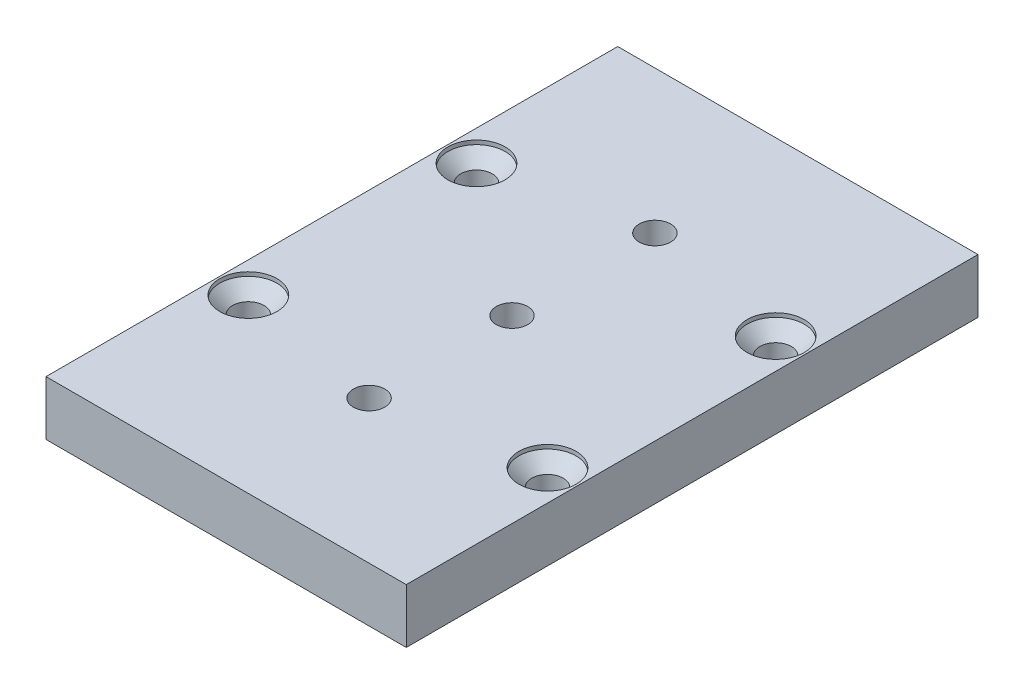
ISO-10303-21;
HEADER;
FILE_DESCRIPTION(('STEP AP214'),'2;1');
FILE_NAME('part.step','',(''),(''),'','','');
FILE_SCHEMA(('AUTOMOTIVE_DESIGN { 1 0 10303 214 1 1 1 1 }'));
ENDSEC;
DATA;
#1=APPLICATION_CONTEXT('core data for automotive mechanical design processes');
#2=APPLICATION_PROTOCOL_DEFINITION('international standard','automotive_design',2000,#1);
#3=PRODUCT_CONTEXT('',#1,'mechanical');
#4=PRODUCT('Part','Part','',(#3));
#5=PRODUCT_RELATED_PRODUCT_CATEGORY('part','',(#4));
#6=PRODUCT_DEFINITION_FORMATION('','',#4);
#7=PRODUCT_DEFINITION_CONTEXT('part definition',#1,'design');
#8=PRODUCT_DEFINITION('design','',#6,#7);
#9=PRODUCT_DEFINITION_SHAPE('','',#8);
#10=(LENGTH_UNIT() NAMED_UNIT(*) SI_UNIT(.MILLI.,.METRE.));
#11=(NAMED_UNIT(*) PLANE_ANGLE_UNIT() SI_UNIT($,.RADIAN.));
#12=(NAMED_UNIT(*) SI_UNIT($,.STERADIAN.) SOLID_ANGLE_UNIT());
#13=UNCERTAINTY_MEASURE_WITH_UNIT(LENGTH_MEASURE(1.E-05),#10,'distance_accuracy_value','');
#14=(GEOMETRIC_REPRESENTATION_CONTEXT(3) GLOBAL_UNCERTAINTY_ASSIGNED_CONTEXT((#13)) GLOBAL_UNIT_ASSIGNED_CONTEXT((#10,
#11,#12)) REPRESENTATION_CONTEXT('',''));
#15=CARTESIAN_POINT('',(0.,0.,0.));
#16=DIRECTION('',(0.,0.,1.));
#17=DIRECTION('',(1.,0.,0.));
#18=AXIS2_PLACEMENT_3D('',#15,#16,#17);
#19=CARTESIAN_POINT('',(-26.1599999999905,10.,-19.9500000000002));
#20=DIRECTION('',(0.,-1.,0.));
#21=DIRECTION('',(0.,0.,-1.));
#22=AXIS2_PLACEMENT_3D('',#19,#20,#21);
#23=CYLINDRICAL_SURFACE('',#22,2.75);
#24=CARTESIAN_POINT('',(-26.1599999999905,6.57500000000001,-19.9500000000002));
#25=DIRECTION('',(0.,1.,0.));
#26=DIRECTION('',(0.,0.,1.));
#27=AXIS2_PLACEMENT_3D('',#24,#25,#26);
#28=CIRCLE('',#27,2.75);
#29=CARTESIAN_POINT('',(-26.1599999999905,6.57500000000001,-17.2000000000002));
#30=VERTEX_POINT('',#29);
#31=EDGE_CURVE('E156',#30,#30,#28,.T.);
#32=ORIENTED_EDGE('',*,*,#31,.T.);
#33=EDGE_LOOP('',(#32));
#34=FACE_BOUND('',#33,.T.);
#35=CARTESIAN_POINT('',(-26.1599999999905,0.,-19.9500000000002));
#36=DIRECTION('',(0.,-1.,0.));
#37=DIRECTION('',(0.,0.,-1.));
#38=AXIS2_PLACEMENT_3D('',#35,#36,#37);
#39=CIRCLE('',#38,2.75);
#40=CARTESIAN_POINT('',(-26.1599999999905,0.,-22.7000000000002));
#41=VERTEX_POINT('',#40);
#42=EDGE_CURVE('E126',#41,#41,#39,.T.);
#43=ORIENTED_EDGE('',*,*,#42,.T.);
#44=EDGE_LOOP('',(#43));
#45=FACE_BOUND('',#44,.T.);
#46=ADVANCED_FACE('F31',(#34,#45),#23,.F.);
#47=CARTESIAN_POINT('',(-26.1599999999905,10.,19.9509032471841));
#48=DIRECTION('',(0.,-1.,0.));
#49=DIRECTION('',(0.,0.,-1.));
#50=AXIS2_PLACEMENT_3D('',#47,#48,#49);
#51=CYLINDRICAL_SURFACE('',#50,2.75);
#52=CARTESIAN_POINT('',(-26.1599999999905,6.575,19.9509032471841));
#53=DIRECTION('',(0.,1.,0.));
#54=DIRECTION('',(0.,0.,1.));
#55=AXIS2_PLACEMENT_3D('',#52,#53,#54);
#56=CIRCLE('',#55,2.75);
#57=CARTESIAN_POINT('',(-26.1599999999905,6.575,22.7009032471841));
#58=VERTEX_POINT('',#57);
#59=EDGE_CURVE('E162',#58,#58,#56,.T.);
#60=ORIENTED_EDGE('',*,*,#59,.T.);
#61=EDGE_LOOP('',(#60));
#62=FACE_BOUND('',#61,.T.);
#63=CARTESIAN_POINT('',(-26.1599999999905,0.,19.9509032471841));
#64=DIRECTION('',(0.,-1.,0.));
#65=DIRECTION('',(0.,0.,-1.));
#66=AXIS2_PLACEMENT_3D('',#63,#64,#65);
#67=CIRCLE('',#66,2.75);
#68=CARTESIAN_POINT('',(-26.1599999999905,0.,17.2009032471841));
#69=VERTEX_POINT('',#68);
#70=EDGE_CURVE('E98',#69,#69,#67,.T.);
#71=ORIENTED_EDGE('',*,*,#70,.T.);
#72=EDGE_LOOP('',(#71));
#73=FACE_BOUND('',#72,.T.);
#74=ADVANCED_FACE('F211',(#62,#73),#51,.F.);
#75=CARTESIAN_POINT('',(26.1600000000095,10.,19.9509032471841));
#76=DIRECTION('',(0.,-1.,0.));
#77=DIRECTION('',(0.,0.,-1.));
#78=AXIS2_PLACEMENT_3D('',#75,#76,#77);
#79=CYLINDRICAL_SURFACE('',#78,2.75);
#80=CARTESIAN_POINT('',(26.1600000000095,6.57500000000001,19.9509032471841));
#81=DIRECTION('',(0.,1.,0.));
#82=DIRECTION('',(0.,0.,1.));
#83=AXIS2_PLACEMENT_3D('',#80,#81,#82);
#84=CIRCLE('',#83,2.75);
#85=CARTESIAN_POINT('',(26.1600000000095,6.57500000000001,22.7009032471841));
#86=VERTEX_POINT('',#85);
#87=EDGE_CURVE('E168',#86,#86,#84,.T.);
#88=ORIENTED_EDGE('',*,*,#87,.T.);
#89=EDGE_LOOP('',(#88));
#90=FACE_BOUND('',#89,.T.);
#91=CARTESIAN_POINT('',(26.1600000000095,0.,19.9509032471841));
#92=DIRECTION('',(0.,-1.,0.));
#93=DIRECTION('',(0.,0.,-1.));
#94=AXIS2_PLACEMENT_3D('',#91,#92,#93);
#95=CIRCLE('',#94,2.75);
#96=CARTESIAN_POINT('',(26.1600000000095,0.,17.2009032471841));
#97=VERTEX_POINT('',#96);
#98=EDGE_CURVE('E117',#97,#97,#95,.T.);
#99=ORIENTED_EDGE('',*,*,#98,.T.);
#100=EDGE_LOOP('',(#99));
#101=FACE_BOUND('',#100,.T.);
#102=ADVANCED_FACE('F213',(#90,#101),#79,.F.);
#103=CARTESIAN_POINT('',(26.1600000000095,10.,-19.9500000000002));
#104=DIRECTION('',(0.,-1.,0.));
#105=DIRECTION('',(0.,0.,-1.));
#106=AXIS2_PLACEMENT_3D('',#103,#104,#105);
#107=CYLINDRICAL_SURFACE('',#106,2.75);
#108=CARTESIAN_POINT('',(26.1600000000095,6.57500000000001,-19.9500000000002));
#109=DIRECTION('',(0.,1.,0.));
#110=DIRECTION('',(0.,0.,1.));
#111=AXIS2_PLACEMENT_3D('',#108,#109,#110);
#112=CIRCLE('',#111,2.75);
#113=CARTESIAN_POINT('',(26.1600000000095,6.57500000000001,-17.2000000000002));
#114=VERTEX_POINT('',#113);
#115=EDGE_CURVE('E150',#114,#114,#112,.T.);
#116=ORIENTED_EDGE('',*,*,#115,.T.);
#117=EDGE_LOOP('',(#116));
#118=FACE_BOUND('',#117,.T.);
#119=CARTESIAN_POINT('',(26.1600000000095,0.,-19.9500000000002));
#120=DIRECTION('',(0.,-1.,0.));
#121=DIRECTION('',(0.,0.,-1.));
#122=AXIS2_PLACEMENT_3D('',#119,#120,#121);
#123=CIRCLE('',#122,2.75);
#124=CARTESIAN_POINT('',(26.1600000000095,0.,-22.7000000000002));
#125=VERTEX_POINT('',#124);
#126=EDGE_CURVE('E135',#125,#125,#123,.T.);
#127=ORIENTED_EDGE('',*,*,#126,.T.);
#128=EDGE_LOOP('',(#127));
#129=FACE_BOUND('',#128,.T.);
#130=ADVANCED_FACE('F220',(#118,#129),#107,.F.);
#131=CARTESIAN_POINT('',(-31.505,9.525,-50.));
#132=DIRECTION('',(1.,0.,0.));
#133=DIRECTION('',(0.,0.,-1.));
#134=AXIS2_PLACEMENT_3D('',#131,#132,#133);
#135=PLANE('',#134);
#136=DIRECTION('',(0.,0.,1.));
#137=VECTOR('',#136,1.);
#138=CARTESIAN_POINT('',(-31.505,0.,-50.));
#139=LINE('',#138,#137);
#140=CARTESIAN_POINT('',(-31.505,0.,-50.));
#141=VERTEX_POINT('',#140);
#142=CARTESIAN_POINT('',(-31.505,0.,50.));
#143=VERTEX_POINT('',#142);
#144=EDGE_CURVE('E95',#141,#143,#139,.T.);
#145=ORIENTED_EDGE('',*,*,#144,.T.);
#146=DIRECTION('',(0.,-1.,0.));
#147=VECTOR('',#146,1.);
#148=CARTESIAN_POINT('',(-31.505,9.525,50.));
#149=LINE('',#148,#147);
#150=CARTESIAN_POINT('',(-31.505,9.525,50.));
#151=VERTEX_POINT('',#150);
#152=EDGE_CURVE('E11',#151,#143,#149,.T.);
#153=ORIENTED_EDGE('',*,*,#152,.F.);
#154=DIRECTION('',(0.,0.,1.));
#155=VECTOR('',#154,1.);
#156=CARTESIAN_POINT('',(-31.505,9.525,-50.));
#157=LINE('',#156,#155);
#158=CARTESIAN_POINT('',(-31.505,9.525,-50.));
#159=VERTEX_POINT('',#158);
#160=EDGE_CURVE('E83',#159,#151,#157,.T.);
#161=ORIENTED_EDGE('',*,*,#160,.F.);
#162=DIRECTION('',(0.,-1.,0.));
#163=VECTOR('',#162,1.);
#164=CARTESIAN_POINT('',(-31.505,9.525,-50.));
#165=LINE('',#164,#163);
#166=EDGE_CURVE('E91',#159,#141,#165,.T.);
#167=ORIENTED_EDGE('',*,*,#166,.T.);
#168=EDGE_LOOP('',(#145,#153,#161,#167));
#169=FACE_BOUND('',#168,.T.);
#170=ADVANCED_FACE('F33',(#169),#135,.F.);
#171=CARTESIAN_POINT('',(-31.505,9.525,50.));
#172=DIRECTION('',(0.,0.,-1.));
#173=DIRECTION('',(-1.,0.,0.));
#174=AXIS2_PLACEMENT_3D('',#171,#172,#173);
#175=PLANE('',#174);
#176=DIRECTION('',(1.,0.,0.));
#177=VECTOR('',#176,1.);
#178=CARTESIAN_POINT('',(-31.505,0.,50.));
#179=LINE('',#178,#177);
#180=CARTESIAN_POINT('',(31.505,0.,50.));
#181=VERTEX_POINT('',#180);
#182=EDGE_CURVE('E87',#143,#181,#179,.T.);
#183=ORIENTED_EDGE('',*,*,#182,.T.);
#184=DIRECTION('',(0.,-1.,0.));
#185=VECTOR('',#184,1.);
#186=CARTESIAN_POINT('',(31.505,9.525,50.));
#187=LINE('',#186,#185);
#188=CARTESIAN_POINT('',(31.505,9.525,50.));
#189=VERTEX_POINT('',#188);
#190=EDGE_CURVE('E40',#189,#181,#187,.T.);
#191=ORIENTED_EDGE('',*,*,#190,.F.);
#192=DIRECTION('',(1.,0.,0.));
#193=VECTOR('',#192,1.);
#194=CARTESIAN_POINT('',(-31.505,9.525,50.));
#195=LINE('',#194,#193);
#196=EDGE_CURVE('E78',#151,#189,#195,.T.);
#197=ORIENTED_EDGE('',*,*,#196,.F.);
#198=ORIENTED_EDGE('',*,*,#152,.T.);
#199=EDGE_LOOP('',(#183,#191,#197,#198));
#200=FACE_BOUND('',#199,.T.);
#201=ADVANCED_FACE('F86',(#200),#175,.F.);
#202=CARTESIAN_POINT('',(31.505,9.525,-50.));
#203=DIRECTION('',(-1.,0.,0.));
#204=DIRECTION('',(0.,0.,1.));
#205=AXIS2_PLACEMENT_3D('',#202,#203,#204);
#206=PLANE('',#205);
#207=DIRECTION('',(0.,0.,-1.));
#208=VECTOR('',#207,1.);
#209=CARTESIAN_POINT('',(31.505,0.,-50.));
#210=LINE('',#209,#208);
#211=CARTESIAN_POINT('',(31.505,0.,-50.));
#212=VERTEX_POINT('',#211);
#213=EDGE_CURVE('E65',#181,#212,#210,.T.);
#214=ORIENTED_EDGE('',*,*,#213,.T.);
#215=DIRECTION('',(0.,-1.,0.));
#216=VECTOR('',#215,1.);
#217=CARTESIAN_POINT('',(31.505,9.525,-50.));
#218=LINE('',#217,#216);
#219=CARTESIAN_POINT('',(31.505,9.525,-50.));
#220=VERTEX_POINT('',#219);
#221=EDGE_CURVE('E88',#220,#212,#218,.T.);
#222=ORIENTED_EDGE('',*,*,#221,.F.);
#223=DIRECTION('',(0.,0.,-1.));
#224=VECTOR('',#223,1.);
#225=CARTESIAN_POINT('',(31.505,9.525,-50.));
#226=LINE('',#225,#224);
#227=EDGE_CURVE('E81',#189,#220,#226,.T.);
#228=ORIENTED_EDGE('',*,*,#227,.F.);
#229=ORIENTED_EDGE('',*,*,#190,.T.);
#230=EDGE_LOOP('',(#214,#222,#228,#229));
#231=FACE_BOUND('',#230,.T.);
#232=ADVANCED_FACE('F89',(#231),#206,.F.);
#233=CARTESIAN_POINT('',(-31.505,9.525,-50.));
#234=DIRECTION('',(0.,0.,1.));
#235=DIRECTION('',(1.,0.,0.));
#236=AXIS2_PLACEMENT_3D('',#233,#234,#235);
#237=PLANE('',#236);
#238=DIRECTION('',(-1.,0.,0.));
#239=VECTOR('',#238,1.);
#240=CARTESIAN_POINT('',(-31.505,0.,-50.));
#241=LINE('',#240,#239);
#242=EDGE_CURVE('E71',#212,#141,#241,.T.);
#243=ORIENTED_EDGE('',*,*,#242,.T.);
#244=ORIENTED_EDGE('',*,*,#166,.F.);
#245=DIRECTION('',(-1.,0.,0.));
#246=VECTOR('',#245,1.);
#247=CARTESIAN_POINT('',(-31.505,9.525,-50.));
#248=LINE('',#247,#246);
#249=EDGE_CURVE('E48',#220,#159,#248,.T.);
#250=ORIENTED_EDGE('',*,*,#249,.F.);
#251=ORIENTED_EDGE('',*,*,#221,.T.);
#252=EDGE_LOOP('',(#243,#244,#250,#251));
#253=FACE_BOUND('',#252,.T.);
#254=ADVANCED_FACE('F103',(#253),#237,.F.);
#255=CARTESIAN_POINT('',(-31.505,9.525,50.));
#256=DIRECTION('',(0.,1.,0.));
#257=DIRECTION('',(0.,0.,1.));
#258=AXIS2_PLACEMENT_3D('',#255,#256,#257);
#259=PLANE('',#258);
#260=CARTESIAN_POINT('',(-26.1599999999905,9.525,-19.9500000000002));
#261=DIRECTION('',(0.,1.,0.));
#262=DIRECTION('',(0.,0.,1.));
#263=AXIS2_PLACEMENT_3D('',#260,#261,#262);
#264=CIRCLE('',#263,5.);
#265=CARTESIAN_POINT('',(-26.1599999999905,9.525,-14.9500000000002));
#266=VERTEX_POINT('',#265);
#267=EDGE_CURVE('E147',#266,#266,#264,.T.);
#268=ORIENTED_EDGE('',*,*,#267,.F.);
#269=EDGE_LOOP('',(#268));
#270=FACE_BOUND('',#269,.T.);
#271=CARTESIAN_POINT('',(-26.1599999999905,9.525,19.9509032471841));
#272=DIRECTION('',(0.,1.,0.));
#273=DIRECTION('',(0.,0.,1.));
#274=AXIS2_PLACEMENT_3D('',#271,#272,#273);
#275=CIRCLE('',#274,5.);
#276=CARTESIAN_POINT('',(-26.1599999999905,9.525,24.9509032471841));
#277=VERTEX_POINT('',#276);
#278=EDGE_CURVE('E144',#277,#277,#275,.T.);
#279=ORIENTED_EDGE('',*,*,#278,.F.);
#280=EDGE_LOOP('',(#279));
#281=FACE_BOUND('',#280,.T.);
#282=CARTESIAN_POINT('',(26.1600000000095,9.525,19.9509032471841));
#283=DIRECTION('',(0.,1.,0.));
#284=DIRECTION('',(0.,0.,1.));
#285=AXIS2_PLACEMENT_3D('',#282,#283,#284);
#286=CIRCLE('',#285,5.);
#287=CARTESIAN_POINT('',(26.1600000000095,9.525,24.9509032471841));
#288=VERTEX_POINT('',#287);
#289=EDGE_CURVE('E141',#288,#288,#286,.T.);
#290=ORIENTED_EDGE('',*,*,#289,.F.);
#291=EDGE_LOOP('',(#290));
#292=FACE_BOUND('',#291,.T.);
#293=CARTESIAN_POINT('',(26.1600000000095,9.525,-19.9500000000002));
#294=DIRECTION('',(0.,1.,0.));
#295=DIRECTION('',(0.,0.,1.));
#296=AXIS2_PLACEMENT_3D('',#293,#294,#295);
#297=CIRCLE('',#296,5.);
#298=CARTESIAN_POINT('',(26.1600000000095,9.525,-14.9500000000002));
#299=VERTEX_POINT('',#298);
#300=EDGE_CURVE('E138',#299,#299,#297,.T.);
#301=ORIENTED_EDGE('',*,*,#300,.F.);
#302=EDGE_LOOP('',(#301));
#303=FACE_BOUND('',#302,.T.);
#304=CARTESIAN_POINT('',(2.74780198594726E-12,9.525,-25.000000000001));
#305=DIRECTION('',(0.,1.,0.));
#306=DIRECTION('',(0.,0.,1.));
#307=AXIS2_PLACEMENT_3D('',#304,#305,#306);
#308=CIRCLE('',#307,2.75);
#309=CARTESIAN_POINT('',(2.74780198594726E-12,9.525,-22.250000000001));
#310=VERTEX_POINT('',#309);
#311=EDGE_CURVE('E129',#310,#310,#308,.T.);
#312=ORIENTED_EDGE('',*,*,#311,.F.);
#313=EDGE_LOOP('',(#312));
#314=FACE_BOUND('',#313,.T.);
#315=CARTESIAN_POINT('',(0.,9.525,0.));
#316=DIRECTION('',(0.,1.,0.));
#317=DIRECTION('',(0.,0.,1.));
#318=AXIS2_PLACEMENT_3D('',#315,#316,#317);
#319=CIRCLE('',#318,2.75);
#320=CARTESIAN_POINT('',(0.,9.525,2.75));
#321=VERTEX_POINT('',#320);
#322=EDGE_CURVE('E120',#321,#321,#319,.T.);
#323=ORIENTED_EDGE('',*,*,#322,.F.);
#324=EDGE_LOOP('',(#323));
#325=FACE_BOUND('',#324,.T.);
#326=CARTESIAN_POINT('',(2.692290834716E-12,9.525,24.9999999999989));
#327=DIRECTION('',(0.,1.,0.));
#328=DIRECTION('',(0.,0.,1.));
#329=AXIS2_PLACEMENT_3D('',#326,#327,#328);
#330=CIRCLE('',#329,2.75);
#331=CARTESIAN_POINT('',(2.692290834716E-12,9.525,27.7499999999989));
#332=VERTEX_POINT('',#331);
#333=EDGE_CURVE('E111',#332,#332,#330,.T.);
#334=ORIENTED_EDGE('',*,*,#333,.F.);
#335=EDGE_LOOP('',(#334));
#336=FACE_BOUND('',#335,.T.);
#337=ORIENTED_EDGE('',*,*,#160,.T.);
#338=ORIENTED_EDGE('',*,*,#196,.T.);
#339=ORIENTED_EDGE('',*,*,#227,.T.);
#340=ORIENTED_EDGE('',*,*,#249,.T.);
#341=EDGE_LOOP('',(#337,#338,#339,#340));
#342=FACE_BOUND('',#341,.T.);
#343=ADVANCED_FACE('F79',(#270,#281,#292,#303,#314,#325,#336,#342),#259,.T.);
#344=CARTESIAN_POINT('',(-31.505,0.,50.));
#345=DIRECTION('',(0.,1.,0.));
#346=DIRECTION('',(0.,0.,1.));
#347=AXIS2_PLACEMENT_3D('',#344,#345,#346);
#348=PLANE('',#347);
#349=ORIENTED_EDGE('',*,*,#126,.F.);
#350=EDGE_LOOP('',(#349));
#351=FACE_BOUND('',#350,.T.);
#352=CARTESIAN_POINT('',(2.74780198594726E-12,0.,-25.000000000001));
#353=DIRECTION('',(0.,-1.,0.));
#354=DIRECTION('',(0.,0.,-1.));
#355=AXIS2_PLACEMENT_3D('',#352,#353,#354);
#356=CIRCLE('',#355,2.75);
#357=CARTESIAN_POINT('',(2.74780198594726E-12,0.,-27.750000000001));
#358=VERTEX_POINT('',#357);
#359=EDGE_CURVE('E132',#358,#358,#356,.T.);
#360=ORIENTED_EDGE('',*,*,#359,.F.);
#361=EDGE_LOOP('',(#360));
#362=FACE_BOUND('',#361,.T.);
#363=ORIENTED_EDGE('',*,*,#42,.F.);
#364=EDGE_LOOP('',(#363));
#365=FACE_BOUND('',#364,.T.);
#366=CARTESIAN_POINT('',(0.,0.,0.));
#367=DIRECTION('',(0.,-1.,0.));
#368=DIRECTION('',(0.,0.,-1.));
#369=AXIS2_PLACEMENT_3D('',#366,#367,#368);
#370=CIRCLE('',#369,2.75);
#371=CARTESIAN_POINT('',(0.,0.,-2.75));
#372=VERTEX_POINT('',#371);
#373=EDGE_CURVE('E123',#372,#372,#370,.T.);
#374=ORIENTED_EDGE('',*,*,#373,.F.);
#375=EDGE_LOOP('',(#374));
#376=FACE_BOUND('',#375,.T.);
#377=ORIENTED_EDGE('',*,*,#98,.F.);
#378=EDGE_LOOP('',(#377));
#379=FACE_BOUND('',#378,.T.);
#380=CARTESIAN_POINT('',(2.692290834716E-12,0.,24.9999999999989));
#381=DIRECTION('',(0.,-1.,0.));
#382=DIRECTION('',(0.,0.,-1.));
#383=AXIS2_PLACEMENT_3D('',#380,#381,#382);
#384=CIRCLE('',#383,2.75);
#385=CARTESIAN_POINT('',(2.692290834716E-12,0.,22.2499999999989));
#386=VERTEX_POINT('',#385);
#387=EDGE_CURVE('E114',#386,#386,#384,.T.);
#388=ORIENTED_EDGE('',*,*,#387,.F.);
#389=EDGE_LOOP('',(#388));
#390=FACE_BOUND('',#389,.T.);
#391=ORIENTED_EDGE('',*,*,#70,.F.);
#392=EDGE_LOOP('',(#391));
#393=FACE_BOUND('',#392,.T.);
#394=ORIENTED_EDGE('',*,*,#144,.F.);
#395=ORIENTED_EDGE('',*,*,#242,.F.);
#396=ORIENTED_EDGE('',*,*,#213,.F.);
#397=ORIENTED_EDGE('',*,*,#182,.F.);
#398=EDGE_LOOP('',(#394,#395,#396,#397));
#399=FACE_BOUND('',#398,.T.);
#400=ADVANCED_FACE('F106',(#351,#362,#365,#376,#379,#390,#393,#399),#348,.F.);
#401=CARTESIAN_POINT('',(2.692290834716E-12,10.,24.9999999999989));
#402=DIRECTION('',(0.,-1.,0.));
#403=DIRECTION('',(0.,0.,-1.));
#404=AXIS2_PLACEMENT_3D('',#401,#402,#403);
#405=CYLINDRICAL_SURFACE('',#404,2.75);
#406=ORIENTED_EDGE('',*,*,#333,.T.);
#407=EDGE_LOOP('',(#406));
#408=FACE_BOUND('',#407,.T.);
#409=ORIENTED_EDGE('',*,*,#387,.T.);
#410=EDGE_LOOP('',(#409));
#411=FACE_BOUND('',#410,.T.);
#412=ADVANCED_FACE('F198',(#408,#411),#405,.F.);
#413=CARTESIAN_POINT('',(0.,10.,0.));
#414=DIRECTION('',(0.,-1.,0.));
#415=DIRECTION('',(0.,0.,-1.));
#416=AXIS2_PLACEMENT_3D('',#413,#414,#415);
#417=CYLINDRICAL_SURFACE('',#416,2.75);
#418=ORIENTED_EDGE('',*,*,#322,.T.);
#419=EDGE_LOOP('',(#418));
#420=FACE_BOUND('',#419,.T.);
#421=ORIENTED_EDGE('',*,*,#373,.T.);
#422=EDGE_LOOP('',(#421));
#423=FACE_BOUND('',#422,.T.);
#424=ADVANCED_FACE('F201',(#420,#423),#417,.F.);
#425=CARTESIAN_POINT('',(2.74780198594726E-12,10.,-25.000000000001));
#426=DIRECTION('',(0.,-1.,0.));
#427=DIRECTION('',(0.,0.,-1.));
#428=AXIS2_PLACEMENT_3D('',#425,#426,#427);
#429=CYLINDRICAL_SURFACE('',#428,2.75);
#430=ORIENTED_EDGE('',*,*,#311,.T.);
#431=EDGE_LOOP('',(#430));
#432=FACE_BOUND('',#431,.T.);
#433=ORIENTED_EDGE('',*,*,#359,.T.);
#434=EDGE_LOOP('',(#433));
#435=FACE_BOUND('',#434,.T.);
#436=ADVANCED_FACE('F243',(#432,#435),#429,.F.);
#437=CARTESIAN_POINT('',(26.1600000000095,8.825,-19.9500000000002));
#438=DIRECTION('',(0.,1.,0.));
#439=DIRECTION('',(0.,0.,1.));
#440=AXIS2_PLACEMENT_3D('',#437,#438,#439);
#441=CYLINDRICAL_SURFACE('',#440,5.);
#442=CARTESIAN_POINT('',(26.1600000000095,8.825,-19.9500000000002));
#443=DIRECTION('',(0.,1.,0.));
#444=DIRECTION('',(0.,0.,1.));
#445=AXIS2_PLACEMENT_3D('',#442,#443,#444);
#446=CIRCLE('',#445,5.);
#447=CARTESIAN_POINT('',(26.1600000000095,8.825,-14.9500000000002));
#448=VERTEX_POINT('',#447);
#449=EDGE_CURVE('E153',#448,#448,#446,.T.);
#450=ORIENTED_EDGE('',*,*,#449,.F.);
#451=EDGE_LOOP('',(#450));
#452=FACE_BOUND('',#451,.T.);
#453=ORIENTED_EDGE('',*,*,#300,.T.);
#454=EDGE_LOOP('',(#453));
#455=FACE_BOUND('',#454,.T.);
#456=ADVANCED_FACE('F182',(#452,#455),#441,.F.);
#457=CARTESIAN_POINT('',(26.1600000000095,8.825,19.9509032471841));
#458=DIRECTION('',(0.,1.,0.));
#459=DIRECTION('',(0.,0.,1.));
#460=AXIS2_PLACEMENT_3D('',#457,#458,#459);
#461=CYLINDRICAL_SURFACE('',#460,5.);
#462=CARTESIAN_POINT('',(26.1600000000095,8.825,19.9509032471841));
#463=DIRECTION('',(0.,1.,0.));
#464=DIRECTION('',(0.,0.,1.));
#465=AXIS2_PLACEMENT_3D('',#462,#463,#464);
#466=CIRCLE('',#465,5.);
#467=CARTESIAN_POINT('',(26.1600000000095,8.825,24.9509032471841));
#468=VERTEX_POINT('',#467);
#469=EDGE_CURVE('E171',#468,#468,#466,.T.);
#470=ORIENTED_EDGE('',*,*,#469,.F.);
#471=EDGE_LOOP('',(#470));
#472=FACE_BOUND('',#471,.T.);
#473=ORIENTED_EDGE('',*,*,#289,.T.);
#474=EDGE_LOOP('',(#473));
#475=FACE_BOUND('',#474,.T.);
#476=ADVANCED_FACE('F178',(#472,#475),#461,.F.);
#477=CARTESIAN_POINT('',(-26.1599999999905,8.825,19.9509032471841));
#478=DIRECTION('',(0.,1.,0.));
#479=DIRECTION('',(0.,0.,1.));
#480=AXIS2_PLACEMENT_3D('',#477,#478,#479);
#481=CYLINDRICAL_SURFACE('',#480,5.);
#482=CARTESIAN_POINT('',(-26.1599999999905,8.825,19.9509032471841));
#483=DIRECTION('',(0.,1.,0.));
#484=DIRECTION('',(0.,0.,1.));
#485=AXIS2_PLACEMENT_3D('',#482,#483,#484);
#486=CIRCLE('',#485,5.);
#487=CARTESIAN_POINT('',(-26.1599999999905,8.825,24.9509032471841));
#488=VERTEX_POINT('',#487);
#489=EDGE_CURVE('E165',#488,#488,#486,.T.);
#490=ORIENTED_EDGE('',*,*,#489,.F.);
#491=EDGE_LOOP('',(#490));
#492=FACE_BOUND('',#491,.T.);
#493=ORIENTED_EDGE('',*,*,#278,.T.);
#494=EDGE_LOOP('',(#493));
#495=FACE_BOUND('',#494,.T.);
#496=ADVANCED_FACE('F181',(#492,#495),#481,.F.);
#497=CARTESIAN_POINT('',(-26.1599999999905,8.825,-19.9500000000002));
#498=DIRECTION('',(0.,1.,0.));
#499=DIRECTION('',(0.,0.,1.));
#500=AXIS2_PLACEMENT_3D('',#497,#498,#499);
#501=CYLINDRICAL_SURFACE('',#500,5.);
#502=CARTESIAN_POINT('',(-26.1599999999905,8.825,-19.9500000000002));
#503=DIRECTION('',(0.,1.,0.));
#504=DIRECTION('',(0.,0.,1.));
#505=AXIS2_PLACEMENT_3D('',#502,#503,#504);
#506=CIRCLE('',#505,5.);
#507=CARTESIAN_POINT('',(-26.1599999999905,8.825,-14.9500000000002));
#508=VERTEX_POINT('',#507);
#509=EDGE_CURVE('E159',#508,#508,#506,.T.);
#510=ORIENTED_EDGE('',*,*,#509,.F.);
#511=EDGE_LOOP('',(#510));
#512=FACE_BOUND('',#511,.T.);
#513=ORIENTED_EDGE('',*,*,#267,.T.);
#514=EDGE_LOOP('',(#513));
#515=FACE_BOUND('',#514,.T.);
#516=ADVANCED_FACE('F280',(#512,#515),#501,.F.);
#517=CARTESIAN_POINT('',(26.1600000000095,8.825,-19.9500000000002));
#518=DIRECTION('',(0.,1.,0.));
#519=DIRECTION('',(0.,0.,1.));
#520=AXIS2_PLACEMENT_3D('',#517,#518,#519);
#521=CONICAL_SURFACE('',#520,5.,0.78539816339745);
#522=ORIENTED_EDGE('',*,*,#449,.T.);
#523=EDGE_LOOP('',(#522));
#524=FACE_BOUND('',#523,.T.);
#525=ORIENTED_EDGE('',*,*,#115,.F.);
#526=EDGE_LOOP('',(#525));
#527=FACE_BOUND('',#526,.T.);
#528=ADVANCED_FACE('F288',(#524,#527),#521,.F.);
#529=CARTESIAN_POINT('',(-26.1599999999905,8.825,-19.9500000000002));
#530=DIRECTION('',(0.,1.,0.));
#531=DIRECTION('',(0.,0.,1.));
#532=AXIS2_PLACEMENT_3D('',#529,#530,#531);
#533=CONICAL_SURFACE('',#532,5.,0.78539816339745);
#534=ORIENTED_EDGE('',*,*,#509,.T.);
#535=EDGE_LOOP('',(#534));
#536=FACE_BOUND('',#535,.T.);
#537=ORIENTED_EDGE('',*,*,#31,.F.);
#538=EDGE_LOOP('',(#537));
#539=FACE_BOUND('',#538,.T.);
#540=ADVANCED_FACE('F297',(#536,#539),#533,.F.);
#541=CARTESIAN_POINT('',(-26.1599999999905,8.825,19.9509032471841));
#542=DIRECTION('',(0.,1.,0.));
#543=DIRECTION('',(0.,0.,1.));
#544=AXIS2_PLACEMENT_3D('',#541,#542,#543);
#545=CONICAL_SURFACE('',#544,5.,0.78539816339745);
#546=ORIENTED_EDGE('',*,*,#489,.T.);
#547=EDGE_LOOP('',(#546));
#548=FACE_BOUND('',#547,.T.);
#549=ORIENTED_EDGE('',*,*,#59,.F.);
#550=EDGE_LOOP('',(#549));
#551=FACE_BOUND('',#550,.T.);
#552=ADVANCED_FACE('F305',(#548,#551),#545,.F.);
#553=CARTESIAN_POINT('',(26.1600000000095,8.825,19.9509032471841));
#554=DIRECTION('',(0.,1.,0.));
#555=DIRECTION('',(0.,0.,1.));
#556=AXIS2_PLACEMENT_3D('',#553,#554,#555);
#557=CONICAL_SURFACE('',#556,5.,0.78539816339745);
#558=ORIENTED_EDGE('',*,*,#469,.T.);
#559=EDGE_LOOP('',(#558));
#560=FACE_BOUND('',#559,.T.);
#561=ORIENTED_EDGE('',*,*,#87,.F.);
#562=EDGE_LOOP('',(#561));
#563=FACE_BOUND('',#562,.T.);
#564=ADVANCED_FACE('F175',(#560,#563),#557,.F.);
#565=CLOSED_SHELL('',(#46,#74,#102,#130,#170,#201,#232,#254,#343,#400,#412,#424,#436,#456,#476,
#496,#516,#528,#540,#552,#564));
#566=MANIFOLD_SOLID_BREP('B2',#565);
#567=ADVANCED_BREP_SHAPE_REPRESENTATION('',(#18,#566),#14);
#568=SHAPE_DEFINITION_REPRESENTATION(#9,#567);
ENDSEC;
END-ISO-10303-21;
